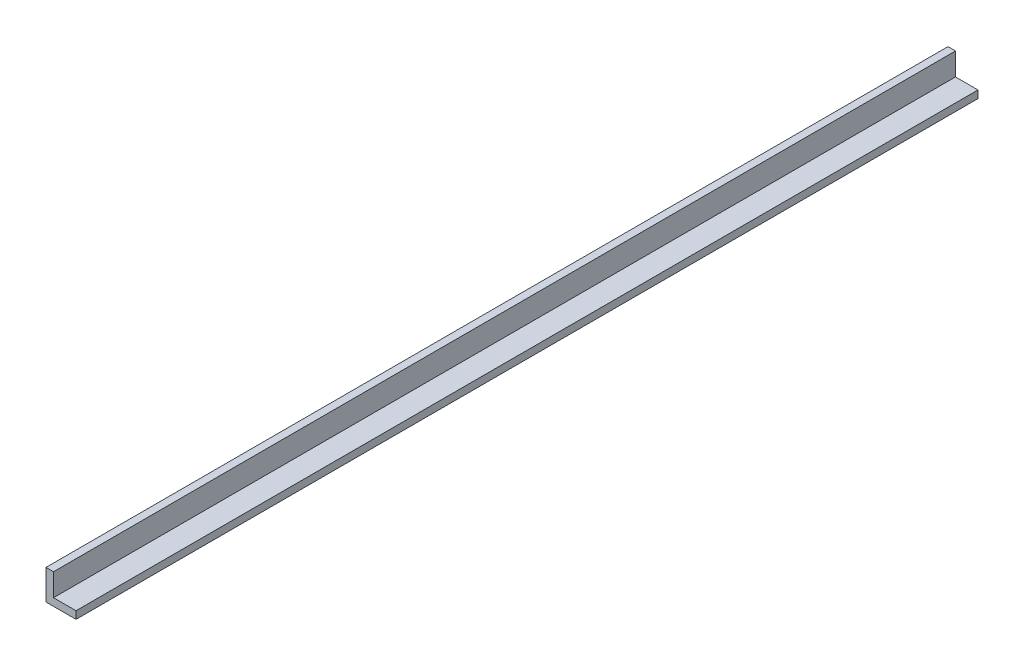
ISO-10303-21;
HEADER;
FILE_DESCRIPTION(('STEP AP214'),'2;1');
FILE_NAME('part.step','',(''),(''),'','','');
FILE_SCHEMA(('AUTOMOTIVE_DESIGN { 1 0 10303 214 1 1 1 1 }'));
ENDSEC;
DATA;
#1=APPLICATION_CONTEXT('core data for automotive mechanical design processes');
#2=APPLICATION_PROTOCOL_DEFINITION('international standard','automotive_design',2000,#1);
#3=PRODUCT_CONTEXT('',#1,'mechanical');
#4=PRODUCT('Part','Part','',(#3));
#5=PRODUCT_RELATED_PRODUCT_CATEGORY('part','',(#4));
#6=PRODUCT_DEFINITION_FORMATION('','',#4);
#7=PRODUCT_DEFINITION_CONTEXT('part definition',#1,'design');
#8=PRODUCT_DEFINITION('design','',#6,#7);
#9=PRODUCT_DEFINITION_SHAPE('','',#8);
#10=(LENGTH_UNIT() NAMED_UNIT(*) SI_UNIT(.MILLI.,.METRE.));
#11=(NAMED_UNIT(*) PLANE_ANGLE_UNIT() SI_UNIT($,.RADIAN.));
#12=(NAMED_UNIT(*) SI_UNIT($,.STERADIAN.) SOLID_ANGLE_UNIT());
#13=UNCERTAINTY_MEASURE_WITH_UNIT(LENGTH_MEASURE(1.E-05),#10,'distance_accuracy_value','');
#14=(GEOMETRIC_REPRESENTATION_CONTEXT(3) GLOBAL_UNCERTAINTY_ASSIGNED_CONTEXT((#13)) GLOBAL_UNIT_ASSIGNED_CONTEXT((#10,
#11,#12)) REPRESENTATION_CONTEXT('',''));
#15=CARTESIAN_POINT('',(0.,0.,0.));
#16=DIRECTION('',(0.,0.,1.));
#17=DIRECTION('',(1.,0.,0.));
#18=AXIS2_PLACEMENT_3D('',#15,#16,#17);
#19=CARTESIAN_POINT('',(50.8,203.,-6100.));
#20=DIRECTION('',(0.,1.,0.));
#21=DIRECTION('',(0.,0.,1.));
#22=AXIS2_PLACEMENT_3D('',#19,#20,#21);
#23=PLANE('',#22);
#24=DIRECTION('',(-1.,0.,0.));
#25=VECTOR('',#24,1.);
#26=CARTESIAN_POINT('',(50.8,203.,0.));
#27=LINE('',#26,#25);
#28=CARTESIAN_POINT('',(50.8,203.,0.));
#29=VERTEX_POINT('',#28);
#30=CARTESIAN_POINT('',(0.,203.,0.));
#31=VERTEX_POINT('',#30);
#32=EDGE_CURVE('E118',#29,#31,#27,.T.);
#33=ORIENTED_EDGE('',*,*,#32,.F.);
#34=DIRECTION('',(0.,0.,1.));
#35=VECTOR('',#34,1.);
#36=CARTESIAN_POINT('',(50.8,203.,-6100.));
#37=LINE('',#36,#35);
#38=CARTESIAN_POINT('',(50.8,203.,-6100.));
#39=VERTEX_POINT('',#38);
#40=EDGE_CURVE('E11',#39,#29,#37,.T.);
#41=ORIENTED_EDGE('',*,*,#40,.F.);
#42=DIRECTION('',(-1.,0.,0.));
#43=VECTOR('',#42,1.);
#44=CARTESIAN_POINT('',(50.8,203.,-6100.));
#45=LINE('',#44,#43);
#46=CARTESIAN_POINT('',(0.,203.,-6100.));
#47=VERTEX_POINT('',#46);
#48=EDGE_CURVE('E132',#39,#47,#45,.T.);
#49=ORIENTED_EDGE('',*,*,#48,.T.);
#50=DIRECTION('',(0.,0.,1.));
#51=VECTOR('',#50,1.);
#52=CARTESIAN_POINT('',(0.,203.,-6100.));
#53=LINE('',#52,#51);
#54=EDGE_CURVE('E36',#47,#31,#53,.T.);
#55=ORIENTED_EDGE('',*,*,#54,.T.);
#56=EDGE_LOOP('',(#33,#41,#49,#55));
#57=FACE_BOUND('',#56,.T.);
#58=ADVANCED_FACE('F33',(#57),#23,.T.);
#59=CARTESIAN_POINT('',(50.8,50.8,-6100.));
#60=DIRECTION('',(1.,0.,0.));
#61=DIRECTION('',(0.,1.,0.));
#62=AXIS2_PLACEMENT_3D('',#59,#60,#61);
#63=PLANE('',#62);
#64=DIRECTION('',(0.,1.,0.));
#65=VECTOR('',#64,1.);
#66=CARTESIAN_POINT('',(50.8,50.8,0.));
#67=LINE('',#66,#65);
#68=CARTESIAN_POINT('',(50.8,50.8,0.));
#69=VERTEX_POINT('',#68);
#70=EDGE_CURVE('E130',#69,#29,#67,.T.);
#71=ORIENTED_EDGE('',*,*,#70,.F.);
#72=DIRECTION('',(0.,0.,1.));
#73=VECTOR('',#72,1.);
#74=CARTESIAN_POINT('',(50.8,50.8,-6100.));
#75=LINE('',#74,#73);
#76=CARTESIAN_POINT('',(50.8,50.8,-6100.));
#77=VERTEX_POINT('',#76);
#78=EDGE_CURVE('E42',#77,#69,#75,.T.);
#79=ORIENTED_EDGE('',*,*,#78,.F.);
#80=DIRECTION('',(0.,1.,0.));
#81=VECTOR('',#80,1.);
#82=CARTESIAN_POINT('',(50.8,50.8,-6100.));
#83=LINE('',#82,#81);
#84=EDGE_CURVE('E108',#77,#39,#83,.T.);
#85=ORIENTED_EDGE('',*,*,#84,.T.);
#86=ORIENTED_EDGE('',*,*,#40,.T.);
#87=EDGE_LOOP('',(#71,#79,#85,#86));
#88=FACE_BOUND('',#87,.T.);
#89=ADVANCED_FACE('F140',(#88),#63,.T.);
#90=CARTESIAN_POINT('',(203.,50.8,-6100.));
#91=DIRECTION('',(0.,1.,0.));
#92=DIRECTION('',(-1.,0.,0.));
#93=AXIS2_PLACEMENT_3D('',#90,#91,#92);
#94=PLANE('',#93);
#95=DIRECTION('',(-1.,0.,0.));
#96=VECTOR('',#95,1.);
#97=CARTESIAN_POINT('',(203.,50.8,0.));
#98=LINE('',#97,#96);
#99=CARTESIAN_POINT('',(203.,50.8,0.));
#100=VERTEX_POINT('',#99);
#101=EDGE_CURVE('E95',#100,#69,#98,.T.);
#102=ORIENTED_EDGE('',*,*,#101,.F.);
#103=DIRECTION('',(0.,0.,1.));
#104=VECTOR('',#103,1.);
#105=CARTESIAN_POINT('',(203.,50.8,-6100.));
#106=LINE('',#105,#104);
#107=CARTESIAN_POINT('',(203.,50.8,-6100.));
#108=VERTEX_POINT('',#107);
#109=EDGE_CURVE('E90',#108,#100,#106,.T.);
#110=ORIENTED_EDGE('',*,*,#109,.F.);
#111=DIRECTION('',(-1.,0.,0.));
#112=VECTOR('',#111,1.);
#113=CARTESIAN_POINT('',(203.,50.8,-6100.));
#114=LINE('',#113,#112);
#115=EDGE_CURVE('E93',#108,#77,#114,.T.);
#116=ORIENTED_EDGE('',*,*,#115,.T.);
#117=ORIENTED_EDGE('',*,*,#78,.T.);
#118=EDGE_LOOP('',(#102,#110,#116,#117));
#119=FACE_BOUND('',#118,.T.);
#120=ADVANCED_FACE('F92',(#119),#94,.T.);
#121=CARTESIAN_POINT('',(203.,0.,-6100.));
#122=DIRECTION('',(1.,0.,0.));
#123=DIRECTION('',(0.,0.,-1.));
#124=AXIS2_PLACEMENT_3D('',#121,#122,#123);
#125=PLANE('',#124);
#126=DIRECTION('',(0.,1.,0.));
#127=VECTOR('',#126,1.);
#128=CARTESIAN_POINT('',(203.,0.,0.));
#129=LINE('',#128,#127);
#130=CARTESIAN_POINT('',(203.,0.,0.));
#131=VERTEX_POINT('',#130);
#132=EDGE_CURVE('E127',#131,#100,#129,.T.);
#133=ORIENTED_EDGE('',*,*,#132,.F.);
#134=DIRECTION('',(0.,0.,1.));
#135=VECTOR('',#134,1.);
#136=CARTESIAN_POINT('',(203.,0.,-6100.));
#137=LINE('',#136,#135);
#138=CARTESIAN_POINT('',(203.,0.,-6100.));
#139=VERTEX_POINT('',#138);
#140=EDGE_CURVE('E100',#139,#131,#137,.T.);
#141=ORIENTED_EDGE('',*,*,#140,.F.);
#142=DIRECTION('',(0.,1.,0.));
#143=VECTOR('',#142,1.);
#144=CARTESIAN_POINT('',(203.,0.,-6100.));
#145=LINE('',#144,#143);
#146=EDGE_CURVE('E106',#139,#108,#145,.T.);
#147=ORIENTED_EDGE('',*,*,#146,.T.);
#148=ORIENTED_EDGE('',*,*,#109,.T.);
#149=EDGE_LOOP('',(#133,#141,#147,#148));
#150=FACE_BOUND('',#149,.T.);
#151=ADVANCED_FACE('F110',(#150),#125,.T.);
#152=CARTESIAN_POINT('',(0.,0.,-6100.));
#153=DIRECTION('',(0.,-1.,0.));
#154=DIRECTION('',(0.,0.,-1.));
#155=AXIS2_PLACEMENT_3D('',#152,#153,#154);
#156=PLANE('',#155);
#157=DIRECTION('',(1.,0.,0.));
#158=VECTOR('',#157,1.);
#159=CARTESIAN_POINT('',(0.,0.,0.));
#160=LINE('',#159,#158);
#161=CARTESIAN_POINT('',(0.,0.,0.));
#162=VERTEX_POINT('',#161);
#163=EDGE_CURVE('E124',#162,#131,#160,.T.);
#164=ORIENTED_EDGE('',*,*,#163,.F.);
#165=DIRECTION('',(0.,0.,1.));
#166=VECTOR('',#165,1.);
#167=CARTESIAN_POINT('',(0.,0.,-6100.));
#168=LINE('',#167,#166);
#169=CARTESIAN_POINT('',(0.,0.,-6100.));
#170=VERTEX_POINT('',#169);
#171=EDGE_CURVE('E135',#170,#162,#168,.T.);
#172=ORIENTED_EDGE('',*,*,#171,.F.);
#173=DIRECTION('',(1.,0.,0.));
#174=VECTOR('',#173,1.);
#175=CARTESIAN_POINT('',(0.,0.,-6100.));
#176=LINE('',#175,#174);
#177=EDGE_CURVE('E111',#170,#139,#176,.T.);
#178=ORIENTED_EDGE('',*,*,#177,.T.);
#179=ORIENTED_EDGE('',*,*,#140,.T.);
#180=EDGE_LOOP('',(#164,#172,#178,#179));
#181=FACE_BOUND('',#180,.T.);
#182=ADVANCED_FACE('F153',(#181),#156,.T.);
#183=CARTESIAN_POINT('',(0.,203.,-6100.));
#184=DIRECTION('',(-1.,0.,0.));
#185=DIRECTION('',(0.,-1.,0.));
#186=AXIS2_PLACEMENT_3D('',#183,#184,#185);
#187=PLANE('',#186);
#188=DIRECTION('',(0.,-1.,0.));
#189=VECTOR('',#188,1.);
#190=CARTESIAN_POINT('',(0.,203.,0.));
#191=LINE('',#190,#189);
#192=EDGE_CURVE('E121',#31,#162,#191,.T.);
#193=ORIENTED_EDGE('',*,*,#192,.F.);
#194=ORIENTED_EDGE('',*,*,#54,.F.);
#195=DIRECTION('',(0.,-1.,0.));
#196=VECTOR('',#195,1.);
#197=CARTESIAN_POINT('',(0.,203.,-6100.));
#198=LINE('',#197,#196);
#199=EDGE_CURVE('E113',#47,#170,#198,.T.);
#200=ORIENTED_EDGE('',*,*,#199,.T.);
#201=ORIENTED_EDGE('',*,*,#171,.T.);
#202=EDGE_LOOP('',(#193,#194,#200,#201));
#203=FACE_BOUND('',#202,.T.);
#204=ADVANCED_FACE('F137',(#203),#187,.T.);
#205=CARTESIAN_POINT('',(0.,0.,-6100.));
#206=DIRECTION('',(0.,0.,1.));
#207=DIRECTION('',(1.,0.,0.));
#208=AXIS2_PLACEMENT_3D('',#205,#206,#207);
#209=PLANE('',#208);
#210=ORIENTED_EDGE('',*,*,#48,.F.);
#211=ORIENTED_EDGE('',*,*,#84,.F.);
#212=ORIENTED_EDGE('',*,*,#115,.F.);
#213=ORIENTED_EDGE('',*,*,#146,.F.);
#214=ORIENTED_EDGE('',*,*,#177,.F.);
#215=ORIENTED_EDGE('',*,*,#199,.F.);
#216=EDGE_LOOP('',(#210,#211,#212,#213,#214,#215));
#217=FACE_BOUND('',#216,.T.);
#218=ADVANCED_FACE('F104',(#217),#209,.F.);
#219=CARTESIAN_POINT('',(0.,0.,0.));
#220=DIRECTION('',(0.,0.,1.));
#221=DIRECTION('',(1.,0.,0.));
#222=AXIS2_PLACEMENT_3D('',#219,#220,#221);
#223=PLANE('',#222);
#224=ORIENTED_EDGE('',*,*,#32,.T.);
#225=ORIENTED_EDGE('',*,*,#192,.T.);
#226=ORIENTED_EDGE('',*,*,#163,.T.);
#227=ORIENTED_EDGE('',*,*,#132,.T.);
#228=ORIENTED_EDGE('',*,*,#101,.T.);
#229=ORIENTED_EDGE('',*,*,#70,.T.);
#230=EDGE_LOOP('',(#224,#225,#226,#227,#228,#229));
#231=FACE_BOUND('',#230,.T.);
#232=ADVANCED_FACE('F139',(#231),#223,.T.);
#233=CLOSED_SHELL('',(#58,#89,#120,#151,#182,#204,#218,#232));
#234=MANIFOLD_SOLID_BREP('B2',#233);
#235=ADVANCED_BREP_SHAPE_REPRESENTATION('',(#18,#234),#14);
#236=SHAPE_DEFINITION_REPRESENTATION(#9,#235);
ENDSEC;
END-ISO-10303-21;
